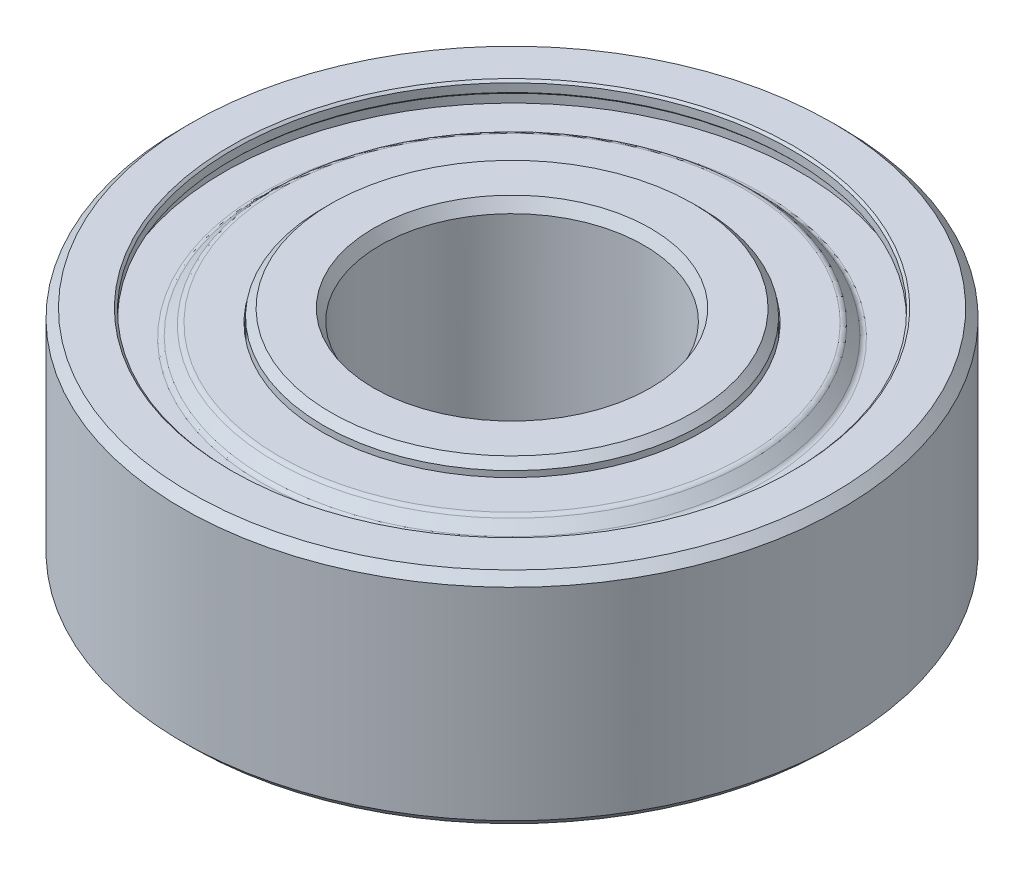
ISO-10303-21;
HEADER;
FILE_DESCRIPTION(('STEP AP214'),'2;1');
FILE_NAME('part.step','',(''),(''),'','','');
FILE_SCHEMA(('AUTOMOTIVE_DESIGN { 1 0 10303 214 1 1 1 1 }'));
ENDSEC;
DATA;
#1=APPLICATION_CONTEXT('core data for automotive mechanical design processes');
#2=APPLICATION_PROTOCOL_DEFINITION('international standard','automotive_design',2000,#1);
#3=PRODUCT_CONTEXT('',#1,'mechanical');
#4=PRODUCT('Part','Part','',(#3));
#5=PRODUCT_RELATED_PRODUCT_CATEGORY('part','',(#4));
#6=PRODUCT_DEFINITION_FORMATION('','',#4);
#7=PRODUCT_DEFINITION_CONTEXT('part definition',#1,'design');
#8=PRODUCT_DEFINITION('design','',#6,#7);
#9=PRODUCT_DEFINITION_SHAPE('','',#8);
#10=(LENGTH_UNIT() NAMED_UNIT(*) SI_UNIT(.MILLI.,.METRE.));
#11=(NAMED_UNIT(*) PLANE_ANGLE_UNIT() SI_UNIT($,.RADIAN.));
#12=(NAMED_UNIT(*) SI_UNIT($,.STERADIAN.) SOLID_ANGLE_UNIT());
#13=UNCERTAINTY_MEASURE_WITH_UNIT(LENGTH_MEASURE(1.E-05),#10,'distance_accuracy_value','');
#14=(GEOMETRIC_REPRESENTATION_CONTEXT(3) GLOBAL_UNCERTAINTY_ASSIGNED_CONTEXT((#13)) GLOBAL_UNIT_ASSIGNED_CONTEXT((#10,
#11,#12)) REPRESENTATION_CONTEXT('',''));
#15=CARTESIAN_POINT('',(0.,0.,0.));
#16=DIRECTION('',(0.,0.,1.));
#17=DIRECTION('',(1.,0.,0.));
#18=AXIS2_PLACEMENT_3D('',#15,#16,#17);
#19=CARTESIAN_POINT('',(0.,0.,0.));
#20=DIRECTION('',(0.,1.,0.));
#21=DIRECTION('',(0.,0.,1.));
#22=AXIS2_PLACEMENT_3D('',#19,#20,#21);
#23=CYLINDRICAL_SURFACE('',#22,3.);
#24=CARTESIAN_POINT('',(0.,4.74019237890388,0.));
#25=DIRECTION('',(0.,1.,0.));
#26=DIRECTION('',(0.,0.,1.));
#27=AXIS2_PLACEMENT_3D('',#24,#25,#26);
#28=CIRCLE('',#27,2.9999999999859);
#29=CARTESIAN_POINT('',(0.,4.74019237890388,2.9999999999859));
#30=VERTEX_POINT('',#29);
#31=EDGE_CURVE('E420',#30,#30,#28,.T.);
#32=ORIENTED_EDGE('',*,*,#31,.T.);
#33=EDGE_LOOP('',(#32));
#34=FACE_BOUND('',#33,.T.);
#35=CARTESIAN_POINT('',(0.,0.259807621148411,0.));
#36=DIRECTION('',(0.,-1.,0.));
#37=DIRECTION('',(0.,0.,-1.));
#38=AXIS2_PLACEMENT_3D('',#35,#36,#37);
#39=CIRCLE('',#38,3.00000000004275);
#40=CARTESIAN_POINT('',(0.,0.259807621148411,-3.00000000004275));
#41=VERTEX_POINT('',#40);
#42=EDGE_CURVE('E417',#41,#41,#39,.T.);
#43=ORIENTED_EDGE('',*,*,#42,.T.);
#44=EDGE_LOOP('',(#43));
#45=FACE_BOUND('',#44,.T.);
#46=ADVANCED_FACE('F16',(#34,#45),#23,.F.);
#47=CARTESIAN_POINT('',(0.,5.0000000000523,0.));
#48=DIRECTION('',(0.,1.,0.));
#49=DIRECTION('',(0.,0.,1.));
#50=AXIS2_PLACEMENT_3D('',#47,#48,#49);
#51=CONICAL_SURFACE('',#50,3.15000000000509,0.523598775631897);
#52=ORIENTED_EDGE('',*,*,#31,.F.);
#53=EDGE_LOOP('',(#52));
#54=FACE_BOUND('',#53,.T.);
#55=CARTESIAN_POINT('',(0.,5.0000000000523,0.));
#56=DIRECTION('',(0.,1.,0.));
#57=DIRECTION('',(0.,0.,1.));
#58=AXIS2_PLACEMENT_3D('',#55,#56,#57);
#59=CIRCLE('',#58,3.15000000000509);
#60=CARTESIAN_POINT('',(0.,5.0000000000523,3.15000000000509));
#61=VERTEX_POINT('',#60);
#62=EDGE_CURVE('E415',#61,#61,#59,.F.);
#63=ORIENTED_EDGE('',*,*,#62,.F.);
#64=EDGE_LOOP('',(#63));
#65=FACE_BOUND('',#64,.T.);
#66=ADVANCED_FACE('F185',(#54,#65),#51,.F.);
#67=CARTESIAN_POINT('',(0.,5.6843418860808E-11,0.));
#68=DIRECTION('',(0.,-1.,0.));
#69=DIRECTION('',(0.,0.,-1.));
#70=AXIS2_PLACEMENT_3D('',#67,#68,#69);
#71=CONICAL_SURFACE('',#70,3.15000000000509,0.523598775562543);
#72=CARTESIAN_POINT('',(0.,5.6843418860808E-11,0.));
#73=DIRECTION('',(0.,-1.,0.));
#74=DIRECTION('',(0.,0.,-1.));
#75=AXIS2_PLACEMENT_3D('',#72,#73,#74);
#76=CIRCLE('',#75,3.15000000000509);
#77=CARTESIAN_POINT('',(0.,5.6843418860808E-11,-3.15000000000509));
#78=VERTEX_POINT('',#77);
#79=EDGE_CURVE('E413',#78,#78,#76,.T.);
#80=ORIENTED_EDGE('',*,*,#79,.T.);
#81=EDGE_LOOP('',(#80));
#82=FACE_BOUND('',#81,.T.);
#83=ORIENTED_EDGE('',*,*,#42,.F.);
#84=EDGE_LOOP('',(#83));
#85=FACE_BOUND('',#84,.T.);
#86=ADVANCED_FACE('F182',(#82,#85),#71,.F.);
#87=CARTESIAN_POINT('',(0.,5.,0.));
#88=DIRECTION('',(0.,1.,0.));
#89=DIRECTION('',(0.,0.,1.));
#90=AXIS2_PLACEMENT_3D('',#87,#88,#89);
#91=PLANE('',#90);
#92=ORIENTED_EDGE('',*,*,#62,.T.);
#93=EDGE_LOOP('',(#92));
#94=FACE_BOUND('',#93,.T.);
#95=CARTESIAN_POINT('',(0.,4.99999999993861,0.));
#96=DIRECTION('',(0.,-1.,0.));
#97=DIRECTION('',(0.,0.,-1.));
#98=AXIS2_PLACEMENT_3D('',#95,#96,#97);
#99=CIRCLE('',#98,4.12000000000035);
#100=CARTESIAN_POINT('',(0.,4.99999999993861,-4.12000000000035));
#101=VERTEX_POINT('',#100);
#102=EDGE_CURVE('E410',#101,#101,#99,.T.);
#103=ORIENTED_EDGE('',*,*,#102,.F.);
#104=EDGE_LOOP('',(#103));
#105=FACE_BOUND('',#104,.T.);
#106=ADVANCED_FACE('F178',(#94,#105),#91,.T.);
#107=CARTESIAN_POINT('',(0.,0.,0.));
#108=DIRECTION('',(0.,1.,0.));
#109=DIRECTION('',(0.,0.,1.));
#110=AXIS2_PLACEMENT_3D('',#107,#108,#109);
#111=PLANE('',#110);
#112=ORIENTED_EDGE('',*,*,#79,.F.);
#113=EDGE_LOOP('',(#112));
#114=FACE_BOUND('',#113,.T.);
#115=CARTESIAN_POINT('',(0.,0.,0.));
#116=DIRECTION('',(0.,1.,0.));
#117=DIRECTION('',(0.,0.,1.));
#118=AXIS2_PLACEMENT_3D('',#115,#116,#117);
#119=CIRCLE('',#118,4.12000000000035);
#120=CARTESIAN_POINT('',(0.,0.,4.12000000000035));
#121=VERTEX_POINT('',#120);
#122=EDGE_CURVE('E406',#121,#121,#119,.T.);
#123=ORIENTED_EDGE('',*,*,#122,.F.);
#124=EDGE_LOOP('',(#123));
#125=FACE_BOUND('',#124,.T.);
#126=ADVANCED_FACE('F174',(#114,#125),#111,.F.);
#127=CARTESIAN_POINT('',(0.,4.82999999996991,0.));
#128=DIRECTION('',(0.,-1.,0.));
#129=DIRECTION('',(0.,0.,-1.));
#130=AXIS2_PLACEMENT_3D('',#127,#128,#129);
#131=CONICAL_SURFACE('',#130,4.28999999996904,0.785398163397448);
#132=CARTESIAN_POINT('',(0.,4.83,0.));
#133=DIRECTION('',(0.,1.,0.));
#134=DIRECTION('',(0.,0.,1.));
#135=AXIS2_PLACEMENT_3D('',#132,#133,#134);
#136=CIRCLE('',#135,4.29);
#137=CARTESIAN_POINT('',(0.,4.83,4.29));
#138=VERTEX_POINT('',#137);
#139=EDGE_CURVE('E409',#138,#138,#136,.F.);
#140=ORIENTED_EDGE('',*,*,#139,.F.);
#141=EDGE_LOOP('',(#140));
#142=FACE_BOUND('',#141,.T.);
#143=ORIENTED_EDGE('',*,*,#102,.T.);
#144=EDGE_LOOP('',(#143));
#145=FACE_BOUND('',#144,.T.);
#146=ADVANCED_FACE('F170',(#142,#145),#131,.T.);
#147=CARTESIAN_POINT('',(0.,0.169999999911852,0.));
#148=DIRECTION('',(0.,1.,0.));
#149=DIRECTION('',(0.,0.,1.));
#150=AXIS2_PLACEMENT_3D('',#147,#148,#149);
#151=CONICAL_SURFACE('',#150,4.28999999985535,0.785398163230262);
#152=ORIENTED_EDGE('',*,*,#122,.T.);
#153=EDGE_LOOP('',(#152));
#154=FACE_BOUND('',#153,.T.);
#155=CARTESIAN_POINT('',(0.,0.170000000000003,0.));
#156=DIRECTION('',(0.,-1.,0.));
#157=DIRECTION('',(0.,0.,-1.));
#158=AXIS2_PLACEMENT_3D('',#155,#156,#157);
#159=CIRCLE('',#158,4.29);
#160=CARTESIAN_POINT('',(0.,0.170000000000003,-4.29));
#161=VERTEX_POINT('',#160);
#162=EDGE_CURVE('E78',#161,#161,#159,.F.);
#163=ORIENTED_EDGE('',*,*,#162,.F.);
#164=EDGE_LOOP('',(#163));
#165=FACE_BOUND('',#164,.T.);
#166=ADVANCED_FACE('F166',(#154,#165),#151,.T.);
#167=CARTESIAN_POINT('',(0.,4.71,0.));
#168=DIRECTION('',(0.,1.,0.));
#169=DIRECTION('',(0.,0.,1.));
#170=AXIS2_PLACEMENT_3D('',#167,#168,#169);
#171=CYLINDRICAL_SURFACE('',#170,4.29);
#172=ORIENTED_EDGE('',*,*,#139,.T.);
#173=EDGE_LOOP('',(#172));
#174=FACE_BOUND('',#173,.T.);
#175=CARTESIAN_POINT('',(0.,4.456,0.));
#176=DIRECTION('',(0.,1.,0.));
#177=DIRECTION('',(0.,0.,1.));
#178=AXIS2_PLACEMENT_3D('',#175,#176,#177);
#179=CIRCLE('',#178,4.29);
#180=CARTESIAN_POINT('',(0.,4.456,4.29));
#181=VERTEX_POINT('',#180);
#182=EDGE_CURVE('E403',#181,#181,#179,.F.);
#183=ORIENTED_EDGE('',*,*,#182,.F.);
#184=EDGE_LOOP('',(#183));
#185=FACE_BOUND('',#184,.T.);
#186=ADVANCED_FACE('F162',(#174,#185),#171,.T.);
#187=CARTESIAN_POINT('',(0.,0.3,0.));
#188=DIRECTION('',(0.,-1.,0.));
#189=DIRECTION('',(0.,0.,-1.));
#190=AXIS2_PLACEMENT_3D('',#187,#188,#189);
#191=CYLINDRICAL_SURFACE('',#190,4.29);
#192=CARTESIAN_POINT('',(0.,0.544,0.));
#193=DIRECTION('',(0.,-1.,0.));
#194=DIRECTION('',(0.,0.,-1.));
#195=AXIS2_PLACEMENT_3D('',#192,#193,#194);
#196=CIRCLE('',#195,4.29);
#197=CARTESIAN_POINT('',(0.,0.544,-4.29));
#198=VERTEX_POINT('',#197);
#199=EDGE_CURVE('E400',#198,#198,#196,.F.);
#200=ORIENTED_EDGE('',*,*,#199,.F.);
#201=EDGE_LOOP('',(#200));
#202=FACE_BOUND('',#201,.T.);
#203=ORIENTED_EDGE('',*,*,#162,.T.);
#204=EDGE_LOOP('',(#203));
#205=FACE_BOUND('',#204,.T.);
#206=ADVANCED_FACE('F158',(#202,#205),#191,.T.);
#207=CARTESIAN_POINT('',(0.,4.456,0.));
#208=DIRECTION('',(0.,1.,0.));
#209=DIRECTION('',(0.,0.,1.));
#210=AXIS2_PLACEMENT_3D('',#207,#208,#209);
#211=PLANE('',#210);
#212=CARTESIAN_POINT('',(0.,4.456,0.));
#213=DIRECTION('',(0.,1.,0.));
#214=DIRECTION('',(0.,0.,1.));
#215=AXIS2_PLACEMENT_3D('',#212,#213,#214);
#216=CIRCLE('',#215,4.315);
#217=CARTESIAN_POINT('',(0.,4.456,4.315));
#218=VERTEX_POINT('',#217);
#219=EDGE_CURVE('E397',#218,#218,#216,.T.);
#220=ORIENTED_EDGE('',*,*,#219,.T.);
#221=EDGE_LOOP('',(#220));
#222=FACE_BOUND('',#221,.T.);
#223=ORIENTED_EDGE('',*,*,#182,.T.);
#224=EDGE_LOOP('',(#223));
#225=FACE_BOUND('',#224,.T.);
#226=ADVANCED_FACE('F154',(#222,#225),#211,.T.);
#227=CARTESIAN_POINT('',(0.,0.544,0.));
#228=DIRECTION('',(0.,-1.,0.));
#229=DIRECTION('',(0.,0.,-1.));
#230=AXIS2_PLACEMENT_3D('',#227,#228,#229);
#231=PLANE('',#230);
#232=CARTESIAN_POINT('',(0.,0.544,0.));
#233=DIRECTION('',(0.,-1.,0.));
#234=DIRECTION('',(0.,0.,-1.));
#235=AXIS2_PLACEMENT_3D('',#232,#233,#234);
#236=CIRCLE('',#235,4.315);
#237=CARTESIAN_POINT('',(0.,0.544,-4.315));
#238=VERTEX_POINT('',#237);
#239=EDGE_CURVE('E394',#238,#238,#236,.T.);
#240=ORIENTED_EDGE('',*,*,#239,.T.);
#241=EDGE_LOOP('',(#240));
#242=FACE_BOUND('',#241,.T.);
#243=ORIENTED_EDGE('',*,*,#199,.T.);
#244=EDGE_LOOP('',(#243));
#245=FACE_BOUND('',#244,.T.);
#246=ADVANCED_FACE('F150',(#242,#245),#231,.T.);
#247=CARTESIAN_POINT('',(0.,4.456,0.));
#248=DIRECTION('',(0.,1.,0.));
#249=DIRECTION('',(0.,0.,1.));
#250=AXIS2_PLACEMENT_3D('',#247,#248,#249);
#251=CYLINDRICAL_SURFACE('',#250,4.315);
#252=CARTESIAN_POINT('',(0.,4.71,0.));
#253=DIRECTION('',(0.,1.,0.));
#254=DIRECTION('',(0.,0.,1.));
#255=AXIS2_PLACEMENT_3D('',#252,#253,#254);
#256=CIRCLE('',#255,4.315);
#257=CARTESIAN_POINT('',(0.,4.71,4.315));
#258=VERTEX_POINT('',#257);
#259=EDGE_CURVE('E391',#258,#258,#256,.F.);
#260=ORIENTED_EDGE('',*,*,#259,.F.);
#261=EDGE_LOOP('',(#260));
#262=FACE_BOUND('',#261,.T.);
#263=ORIENTED_EDGE('',*,*,#219,.F.);
#264=EDGE_LOOP('',(#263));
#265=FACE_BOUND('',#264,.T.);
#266=ADVANCED_FACE('F146',(#262,#265),#251,.F.);
#267=CARTESIAN_POINT('',(0.,0.544,0.));
#268=DIRECTION('',(0.,-1.,0.));
#269=DIRECTION('',(0.,0.,-1.));
#270=AXIS2_PLACEMENT_3D('',#267,#268,#269);
#271=CYLINDRICAL_SURFACE('',#270,4.315);
#272=ORIENTED_EDGE('',*,*,#239,.F.);
#273=EDGE_LOOP('',(#272));
#274=FACE_BOUND('',#273,.T.);
#275=CARTESIAN_POINT('',(0.,0.3,0.));
#276=DIRECTION('',(0.,-1.,0.));
#277=DIRECTION('',(0.,0.,-1.));
#278=AXIS2_PLACEMENT_3D('',#275,#276,#277);
#279=CIRCLE('',#278,4.315);
#280=CARTESIAN_POINT('',(0.,0.3,-4.315));
#281=VERTEX_POINT('',#280);
#282=EDGE_CURVE('E64',#281,#281,#279,.F.);
#283=ORIENTED_EDGE('',*,*,#282,.F.);
#284=EDGE_LOOP('',(#283));
#285=FACE_BOUND('',#284,.T.);
#286=ADVANCED_FACE('F142',(#274,#285),#271,.F.);
#287=CARTESIAN_POINT('',(0.,4.71,0.));
#288=DIRECTION('',(0.,1.,0.));
#289=DIRECTION('',(0.,0.,1.));
#290=AXIS2_PLACEMENT_3D('',#287,#288,#289);
#291=PLANE('',#290);
#292=CARTESIAN_POINT('',(0.,4.71,0.));
#293=DIRECTION('',(0.,-1.,0.));
#294=DIRECTION('',(0.,0.,-1.));
#295=AXIS2_PLACEMENT_3D('',#292,#293,#294);
#296=CIRCLE('',#295,5.27978129677862);
#297=CARTESIAN_POINT('',(0.,4.71,-5.27978129677862));
#298=VERTEX_POINT('',#297);
#299=CARTESIAN_POINT('',(0.,4.71,5.27978129677862));
#300=VERTEX_POINT('',#299);
#301=EDGE_CURVE('E62',#298,#300,#296,.T.);
#302=ORIENTED_EDGE('',*,*,#301,.F.);
#303=CARTESIAN_POINT('',(0.,4.71,0.));
#304=DIRECTION('',(0.,-1.,0.));
#305=DIRECTION('',(0.,0.,1.));
#306=AXIS2_PLACEMENT_3D('',#303,#304,#305);
#307=CIRCLE('',#306,5.27978129677862);
#308=EDGE_CURVE('E56',#300,#298,#307,.T.);
#309=ORIENTED_EDGE('',*,*,#308,.F.);
#310=EDGE_LOOP('',(#302,#309));
#311=FACE_BOUND('',#310,.T.);
#312=ORIENTED_EDGE('',*,*,#259,.T.);
#313=EDGE_LOOP('',(#312));
#314=FACE_BOUND('',#313,.T.);
#315=ADVANCED_FACE('F60',(#311,#314),#291,.T.);
#316=CARTESIAN_POINT('',(0.,0.3,0.));
#317=DIRECTION('',(0.,-1.,0.));
#318=DIRECTION('',(0.,0.,-1.));
#319=AXIS2_PLACEMENT_3D('',#316,#317,#318);
#320=PLANE('',#319);
#321=ORIENTED_EDGE('',*,*,#282,.T.);
#322=EDGE_LOOP('',(#321));
#323=FACE_BOUND('',#322,.T.);
#324=CARTESIAN_POINT('',(0.,0.3,0.));
#325=DIRECTION('',(0.,1.,0.));
#326=DIRECTION('',(0.,0.,1.));
#327=AXIS2_PLACEMENT_3D('',#324,#325,#326);
#328=CIRCLE('',#327,5.27978129677861);
#329=CARTESIAN_POINT('',(0.,0.3,5.27978129677861));
#330=VERTEX_POINT('',#329);
#331=CARTESIAN_POINT('',(0.,0.3,-5.27978129677861));
#332=VERTEX_POINT('',#331);
#333=EDGE_CURVE('E105',#330,#332,#328,.T.);
#334=ORIENTED_EDGE('',*,*,#333,.F.);
#335=CARTESIAN_POINT('',(0.,0.3,0.));
#336=DIRECTION('',(0.,1.,0.));
#337=DIRECTION('',(0.,0.,-1.));
#338=AXIS2_PLACEMENT_3D('',#335,#336,#337);
#339=CIRCLE('',#338,5.27978129677861);
#340=EDGE_CURVE('E70',#332,#330,#339,.T.);
#341=ORIENTED_EDGE('',*,*,#340,.F.);
#342=EDGE_LOOP('',(#334,#341));
#343=FACE_BOUND('',#342,.T.);
#344=ADVANCED_FACE('F91',(#323,#343),#320,.T.);
#345=CARTESIAN_POINT('',(0.,4.56,0.));
#346=DIRECTION('',(0.,1.,0.));
#347=DIRECTION('',(0.,0.,1.));
#348=AXIS2_PLACEMENT_3D('',#345,#346,#347);
#349=TOROIDAL_SURFACE('',#348,5.27978129677862,0.15);
#350=ORIENTED_EDGE('',*,*,#308,.T.);
#351=ORIENTED_EDGE('',*,*,#301,.T.);
#352=EDGE_LOOP('',(#350,#351));
#353=FACE_BOUND('',#352,.T.);
#354=CARTESIAN_POINT('',(0.,4.66606601713693,0.));
#355=DIRECTION('',(0.,-1.,0.));
#356=DIRECTION('',(0.,0.,-1.));
#357=AXIS2_PLACEMENT_3D('',#354,#355,#356);
#358=CIRCLE('',#357,5.38584731390301);
#359=CARTESIAN_POINT('',(0.,4.66606601713693,-5.38584731390301));
#360=VERTEX_POINT('',#359);
#361=EDGE_CURVE('E100',#360,#360,#358,.T.);
#362=ORIENTED_EDGE('',*,*,#361,.F.);
#363=EDGE_LOOP('',(#362));
#364=FACE_BOUND('',#363,.T.);
#365=ADVANCED_FACE('F68',(#353,#364),#349,.T.);
#366=CARTESIAN_POINT('',(0.,0.45,0.));
#367=DIRECTION('',(0.,-1.,0.));
#368=DIRECTION('',(0.,0.,-1.));
#369=AXIS2_PLACEMENT_3D('',#366,#367,#368);
#370=TOROIDAL_SURFACE('',#369,5.27978129677861,0.15);
#371=ORIENTED_EDGE('',*,*,#340,.T.);
#372=ORIENTED_EDGE('',*,*,#333,.T.);
#373=EDGE_LOOP('',(#371,#372));
#374=FACE_BOUND('',#373,.T.);
#375=CARTESIAN_POINT('',(0.,0.343933982776434,0.));
#376=DIRECTION('',(0.,1.,0.));
#377=DIRECTION('',(0.,0.,1.));
#378=AXIS2_PLACEMENT_3D('',#375,#376,#377);
#379=CIRCLE('',#378,5.38584731390301);
#380=CARTESIAN_POINT('',(0.,0.343933982776434,5.38584731390301));
#381=VERTEX_POINT('',#380);
#382=EDGE_CURVE('E352',#381,#381,#379,.T.);
#383=ORIENTED_EDGE('',*,*,#382,.F.);
#384=EDGE_LOOP('',(#383));
#385=FACE_BOUND('',#384,.T.);
#386=ADVANCED_FACE('F90',(#374,#385),#370,.T.);
#387=CARTESIAN_POINT('',(0.,4.45393398274518,0.));
#388=DIRECTION('',(0.,-1.,0.));
#389=DIRECTION('',(0.,0.,-1.));
#390=AXIS2_PLACEMENT_3D('',#387,#388,#389);
#391=CONICAL_SURFACE('',#390,5.59797934829476,0.785398163397448);
#392=CARTESIAN_POINT('',(0.,4.45393398282202,0.));
#393=DIRECTION('',(0.,1.,0.));
#394=DIRECTION('',(0.,0.,1.));
#395=AXIS2_PLACEMENT_3D('',#392,#393,#394);
#396=CIRCLE('',#395,5.59797934831256);
#397=CARTESIAN_POINT('',(0.,4.45393398282202,5.59797934831256));
#398=VERTEX_POINT('',#397);
#399=EDGE_CURVE('E356',#398,#398,#396,.T.);
#400=ORIENTED_EDGE('',*,*,#399,.T.);
#401=EDGE_LOOP('',(#400));
#402=FACE_BOUND('',#401,.T.);
#403=ORIENTED_EDGE('',*,*,#361,.T.);
#404=EDGE_LOOP('',(#403));
#405=FACE_BOUND('',#404,.T.);
#406=ADVANCED_FACE('F531',(#402,#405),#391,.T.);
#407=CARTESIAN_POINT('',(0.,0.546066017193425,0.));
#408=DIRECTION('',(0.,1.,0.));
#409=DIRECTION('',(0.,0.,1.));
#410=AXIS2_PLACEMENT_3D('',#407,#408,#409);
#411=CONICAL_SURFACE('',#410,5.58797934837685,0.785398163538058);
#412=CARTESIAN_POINT('',(0.,0.546066017177981,0.));
#413=DIRECTION('',(0.,-1.,0.));
#414=DIRECTION('',(0.,0.,-1.));
#415=AXIS2_PLACEMENT_3D('',#412,#413,#414);
#416=CIRCLE('',#415,5.58797934831256);
#417=CARTESIAN_POINT('',(0.,0.546066017177981,-5.58797934831256));
#418=VERTEX_POINT('',#417);
#419=EDGE_CURVE('E361',#418,#418,#416,.T.);
#420=ORIENTED_EDGE('',*,*,#419,.T.);
#421=EDGE_LOOP('',(#420));
#422=FACE_BOUND('',#421,.T.);
#423=ORIENTED_EDGE('',*,*,#382,.T.);
#424=EDGE_LOOP('',(#423));
#425=FACE_BOUND('',#424,.T.);
#426=ADVANCED_FACE('F537',(#422,#425),#411,.T.);
#427=CARTESIAN_POINT('',(0.,4.56,0.));
#428=DIRECTION('',(0.,1.,0.));
#429=DIRECTION('',(0.,0.,1.));
#430=AXIS2_PLACEMENT_3D('',#427,#428,#429);
#431=TOROIDAL_SURFACE('',#430,5.70404536549055,0.15);
#432=ORIENTED_EDGE('',*,*,#399,.F.);
#433=EDGE_LOOP('',(#432));
#434=FACE_BOUND('',#433,.T.);
#435=CARTESIAN_POINT('',(0.,4.41,0.));
#436=DIRECTION('',(0.,1.,0.));
#437=DIRECTION('',(0.,0.,-1.));
#438=AXIS2_PLACEMENT_3D('',#435,#436,#437);
#439=CIRCLE('',#438,5.70404536549055);
#440=CARTESIAN_POINT('',(0.,4.41,5.70404536549055));
#441=VERTEX_POINT('',#440);
#442=CARTESIAN_POINT('',(0.,4.41,-5.70404536549055));
#443=VERTEX_POINT('',#442);
#444=EDGE_CURVE('E288',#441,#443,#439,.F.);
#445=ORIENTED_EDGE('',*,*,#444,.F.);
#446=CARTESIAN_POINT('',(0.,4.41,0.));
#447=DIRECTION('',(0.,1.,0.));
#448=DIRECTION('',(0.,0.,1.));
#449=AXIS2_PLACEMENT_3D('',#446,#447,#448);
#450=CIRCLE('',#449,5.70404536549055);
#451=EDGE_CURVE('E298',#443,#441,#450,.F.);
#452=ORIENTED_EDGE('',*,*,#451,.F.);
#453=EDGE_LOOP('',(#445,#452));
#454=FACE_BOUND('',#453,.T.);
#455=ADVANCED_FACE('F313',(#434,#454),#431,.F.);
#456=CARTESIAN_POINT('',(0.,0.44,0.));
#457=DIRECTION('',(0.,-1.,0.));
#458=DIRECTION('',(0.,0.,-1.));
#459=AXIS2_PLACEMENT_3D('',#456,#457,#458);
#460=TOROIDAL_SURFACE('',#459,5.69404536549054,0.15);
#461=ORIENTED_EDGE('',*,*,#419,.F.);
#462=EDGE_LOOP('',(#461));
#463=FACE_BOUND('',#462,.T.);
#464=CARTESIAN_POINT('',(0.,0.59,0.));
#465=DIRECTION('',(0.,-1.,0.));
#466=DIRECTION('',(0.,0.,1.));
#467=AXIS2_PLACEMENT_3D('',#464,#465,#466);
#468=CIRCLE('',#467,5.69404536549054);
#469=CARTESIAN_POINT('',(0.,0.59,-5.69404536549054));
#470=VERTEX_POINT('',#469);
#471=CARTESIAN_POINT('',(0.,0.59,5.69404536549054));
#472=VERTEX_POINT('',#471);
#473=EDGE_CURVE('E376',#470,#472,#468,.F.);
#474=ORIENTED_EDGE('',*,*,#473,.F.);
#475=CARTESIAN_POINT('',(0.,0.59,0.));
#476=DIRECTION('',(0.,-1.,0.));
#477=DIRECTION('',(0.,0.,-1.));
#478=AXIS2_PLACEMENT_3D('',#475,#476,#477);
#479=CIRCLE('',#478,5.69404536549054);
#480=EDGE_CURVE('E35',#472,#470,#479,.F.);
#481=ORIENTED_EDGE('',*,*,#480,.F.);
#482=EDGE_LOOP('',(#474,#481));
#483=FACE_BOUND('',#482,.T.);
#484=ADVANCED_FACE('F309',(#463,#483),#460,.F.);
#485=CARTESIAN_POINT('',(0.,4.41,0.));
#486=DIRECTION('',(0.,1.,0.));
#487=DIRECTION('',(0.,0.,1.));
#488=AXIS2_PLACEMENT_3D('',#485,#486,#487);
#489=PLANE('',#488);
#490=CARTESIAN_POINT('',(0.,4.41,0.));
#491=DIRECTION('',(0.,1.,0.));
#492=DIRECTION('',(0.,0.,1.));
#493=AXIS2_PLACEMENT_3D('',#490,#491,#492);
#494=CIRCLE('',#493,6.55);
#495=CARTESIAN_POINT('',(0.,4.41,6.55));
#496=VERTEX_POINT('',#495);
#497=EDGE_CURVE('E378',#496,#496,#494,.T.);
#498=ORIENTED_EDGE('',*,*,#497,.T.);
#499=EDGE_LOOP('',(#498));
#500=FACE_BOUND('',#499,.T.);
#501=ORIENTED_EDGE('',*,*,#444,.T.);
#502=ORIENTED_EDGE('',*,*,#451,.T.);
#503=EDGE_LOOP('',(#501,#502));
#504=FACE_BOUND('',#503,.T.);
#505=ADVANCED_FACE('F265',(#500,#504),#489,.T.);
#506=CARTESIAN_POINT('',(0.,0.59,0.));
#507=DIRECTION('',(0.,-1.,0.));
#508=DIRECTION('',(0.,0.,-1.));
#509=AXIS2_PLACEMENT_3D('',#506,#507,#508);
#510=PLANE('',#509);
#511=CARTESIAN_POINT('',(0.,0.59,0.));
#512=DIRECTION('',(0.,-1.,0.));
#513=DIRECTION('',(0.,0.,-1.));
#514=AXIS2_PLACEMENT_3D('',#511,#512,#513);
#515=CIRCLE('',#514,6.55);
#516=CARTESIAN_POINT('',(0.,0.59,-6.55));
#517=VERTEX_POINT('',#516);
#518=EDGE_CURVE('E380',#517,#517,#515,.T.);
#519=ORIENTED_EDGE('',*,*,#518,.T.);
#520=EDGE_LOOP('',(#519));
#521=FACE_BOUND('',#520,.T.);
#522=ORIENTED_EDGE('',*,*,#473,.T.);
#523=ORIENTED_EDGE('',*,*,#480,.T.);
#524=EDGE_LOOP('',(#522,#523));
#525=FACE_BOUND('',#524,.T.);
#526=ADVANCED_FACE('F260',(#521,#525),#510,.T.);
#527=CARTESIAN_POINT('',(0.,4.41,0.));
#528=DIRECTION('',(0.,1.,0.));
#529=DIRECTION('',(0.,0.,1.));
#530=AXIS2_PLACEMENT_3D('',#527,#528,#529);
#531=CYLINDRICAL_SURFACE('',#530,6.55);
#532=ORIENTED_EDGE('',*,*,#497,.F.);
#533=EDGE_LOOP('',(#532));
#534=FACE_BOUND('',#533,.T.);
#535=CARTESIAN_POINT('',(0.,4.71,0.));
#536=DIRECTION('',(0.,1.,0.));
#537=DIRECTION('',(0.,0.,1.));
#538=AXIS2_PLACEMENT_3D('',#535,#536,#537);
#539=CIRCLE('',#538,6.55);
#540=CARTESIAN_POINT('',(0.,4.71,6.55));
#541=VERTEX_POINT('',#540);
#542=EDGE_CURVE('E385',#541,#541,#539,.T.);
#543=ORIENTED_EDGE('',*,*,#542,.T.);
#544=EDGE_LOOP('',(#543));
#545=FACE_BOUND('',#544,.T.);
#546=ADVANCED_FACE('F256',(#534,#545),#531,.F.);
#547=CARTESIAN_POINT('',(0.,0.59,0.));
#548=DIRECTION('',(0.,-1.,0.));
#549=DIRECTION('',(0.,0.,-1.));
#550=AXIS2_PLACEMENT_3D('',#547,#548,#549);
#551=CYLINDRICAL_SURFACE('',#550,6.55);
#552=CARTESIAN_POINT('',(0.,0.29,0.));
#553=DIRECTION('',(0.,-1.,0.));
#554=DIRECTION('',(0.,0.,-1.));
#555=AXIS2_PLACEMENT_3D('',#552,#553,#554);
#556=CIRCLE('',#555,6.55);
#557=CARTESIAN_POINT('',(0.,0.29,-6.55));
#558=VERTEX_POINT('',#557);
#559=EDGE_CURVE('E447',#558,#558,#556,.T.);
#560=ORIENTED_EDGE('',*,*,#559,.T.);
#561=EDGE_LOOP('',(#560));
#562=FACE_BOUND('',#561,.T.);
#563=ORIENTED_EDGE('',*,*,#518,.F.);
#564=EDGE_LOOP('',(#563));
#565=FACE_BOUND('',#564,.T.);
#566=ADVANCED_FACE('F252',(#562,#565),#551,.F.);
#567=CARTESIAN_POINT('',(0.,4.71,0.));
#568=DIRECTION('',(0.,1.,0.));
#569=DIRECTION('',(0.,0.,1.));
#570=AXIS2_PLACEMENT_3D('',#567,#568,#569);
#571=PLANE('',#570);
#572=ORIENTED_EDGE('',*,*,#542,.F.);
#573=EDGE_LOOP('',(#572));
#574=FACE_BOUND('',#573,.T.);
#575=CARTESIAN_POINT('',(0.,4.70999999998867,0.));
#576=DIRECTION('',(0.,-1.,0.));
#577=DIRECTION('',(0.,0.,-1.));
#578=AXIS2_PLACEMENT_3D('',#575,#576,#577);
#579=CIRCLE('',#578,6.40000000004193);
#580=CARTESIAN_POINT('',(0.,4.70999999998867,-6.40000000004193));
#581=VERTEX_POINT('',#580);
#582=EDGE_CURVE('E444',#581,#581,#579,.F.);
#583=ORIENTED_EDGE('',*,*,#582,.T.);
#584=EDGE_LOOP('',(#583));
#585=FACE_BOUND('',#584,.T.);
#586=ADVANCED_FACE('F248',(#574,#585),#571,.F.);
#587=CARTESIAN_POINT('',(0.,0.29,0.));
#588=DIRECTION('',(0.,-1.,0.));
#589=DIRECTION('',(0.,0.,-1.));
#590=AXIS2_PLACEMENT_3D('',#587,#588,#589);
#591=PLANE('',#590);
#592=ORIENTED_EDGE('',*,*,#559,.F.);
#593=EDGE_LOOP('',(#592));
#594=FACE_BOUND('',#593,.T.);
#595=CARTESIAN_POINT('',(0.,0.290000000006785,0.));
#596=DIRECTION('',(0.,1.,0.));
#597=DIRECTION('',(0.,0.,1.));
#598=AXIS2_PLACEMENT_3D('',#595,#596,#597);
#599=CIRCLE('',#598,6.39999999998508);
#600=CARTESIAN_POINT('',(0.,0.290000000006785,6.39999999998508));
#601=VERTEX_POINT('',#600);
#602=EDGE_CURVE('E440',#601,#601,#599,.F.);
#603=ORIENTED_EDGE('',*,*,#602,.T.);
#604=EDGE_LOOP('',(#603));
#605=FACE_BOUND('',#604,.T.);
#606=ADVANCED_FACE('F244',(#594,#605),#591,.F.);
#607=CARTESIAN_POINT('',(0.,4.70999999998867,0.));
#608=DIRECTION('',(0.,-1.,0.));
#609=DIRECTION('',(0.,0.,-1.));
#610=AXIS2_PLACEMENT_3D('',#607,#608,#609);
#611=CONICAL_SURFACE('',#610,6.40000000004193,0.785398163397448);
#612=CARTESIAN_POINT('',(0.,4.76,0.));
#613=DIRECTION('',(0.,1.,0.));
#614=DIRECTION('',(0.,0.,1.));
#615=AXIS2_PLACEMENT_3D('',#612,#613,#614);
#616=CIRCLE('',#615,6.35);
#617=CARTESIAN_POINT('',(0.,4.76,6.35));
#618=VERTEX_POINT('',#617);
#619=EDGE_CURVE('E443',#618,#618,#616,.T.);
#620=ORIENTED_EDGE('',*,*,#619,.T.);
#621=EDGE_LOOP('',(#620));
#622=FACE_BOUND('',#621,.T.);
#623=ORIENTED_EDGE('',*,*,#582,.F.);
#624=EDGE_LOOP('',(#623));
#625=FACE_BOUND('',#624,.T.);
#626=ADVANCED_FACE('F240',(#622,#625),#611,.F.);
#627=CARTESIAN_POINT('',(0.,0.290000000006785,0.));
#628=DIRECTION('',(0.,1.,0.));
#629=DIRECTION('',(0.,0.,1.));
#630=AXIS2_PLACEMENT_3D('',#627,#628,#629);
#631=CONICAL_SURFACE('',#630,6.39999999998508,0.785398163397448);
#632=ORIENTED_EDGE('',*,*,#602,.F.);
#633=EDGE_LOOP('',(#632));
#634=FACE_BOUND('',#633,.T.);
#635=CARTESIAN_POINT('',(0.,0.239999999999998,0.));
#636=DIRECTION('',(0.,-1.,0.));
#637=DIRECTION('',(0.,0.,-1.));
#638=AXIS2_PLACEMENT_3D('',#635,#636,#637);
#639=CIRCLE('',#638,6.35);
#640=CARTESIAN_POINT('',(0.,0.239999999999998,-6.35));
#641=VERTEX_POINT('',#640);
#642=EDGE_CURVE('E462',#641,#641,#639,.T.);
#643=ORIENTED_EDGE('',*,*,#642,.T.);
#644=EDGE_LOOP('',(#643));
#645=FACE_BOUND('',#644,.T.);
#646=ADVANCED_FACE('F236',(#634,#645),#631,.F.);
#647=CARTESIAN_POINT('',(0.,4.71,0.));
#648=DIRECTION('',(0.,1.,0.));
#649=DIRECTION('',(0.,0.,1.));
#650=AXIS2_PLACEMENT_3D('',#647,#648,#649);
#651=CYLINDRICAL_SURFACE('',#650,6.35);
#652=ORIENTED_EDGE('',*,*,#619,.F.);
#653=EDGE_LOOP('',(#652));
#654=FACE_BOUND('',#653,.T.);
#655=CARTESIAN_POINT('',(0.,4.94999999995116,0.));
#656=DIRECTION('',(0.,1.,0.));
#657=DIRECTION('',(0.,0.,1.));
#658=AXIS2_PLACEMENT_3D('',#655,#656,#657);
#659=CIRCLE('',#658,6.34999999999764);
#660=CARTESIAN_POINT('',(0.,4.94999999995116,6.34999999999764));
#661=VERTEX_POINT('',#660);
#662=EDGE_CURVE('E464',#661,#661,#659,.T.);
#663=ORIENTED_EDGE('',*,*,#662,.T.);
#664=EDGE_LOOP('',(#663));
#665=FACE_BOUND('',#664,.T.);
#666=ADVANCED_FACE('F232',(#654,#665),#651,.F.);
#667=CARTESIAN_POINT('',(0.,0.3,0.));
#668=DIRECTION('',(0.,-1.,0.));
#669=DIRECTION('',(0.,0.,-1.));
#670=AXIS2_PLACEMENT_3D('',#667,#668,#669);
#671=CYLINDRICAL_SURFACE('',#670,6.35);
#672=CARTESIAN_POINT('',(0.,0.0500000000442924,0.));
#673=DIRECTION('',(0.,-1.,0.));
#674=DIRECTION('',(0.,0.,-1.));
#675=AXIS2_PLACEMENT_3D('',#672,#673,#674);
#676=CIRCLE('',#675,6.34999999999764);
#677=CARTESIAN_POINT('',(0.,0.0500000000442924,-6.34999999999764));
#678=VERTEX_POINT('',#677);
#679=EDGE_CURVE('E439',#678,#678,#676,.T.);
#680=ORIENTED_EDGE('',*,*,#679,.T.);
#681=EDGE_LOOP('',(#680));
#682=FACE_BOUND('',#681,.T.);
#683=ORIENTED_EDGE('',*,*,#642,.F.);
#684=EDGE_LOOP('',(#683));
#685=FACE_BOUND('',#684,.T.);
#686=ADVANCED_FACE('F228',(#682,#685),#671,.F.);
#687=CARTESIAN_POINT('',(0.,4.99999999999545,0.));
#688=DIRECTION('',(0.,1.,0.));
#689=DIRECTION('',(0.,0.,1.));
#690=AXIS2_PLACEMENT_3D('',#687,#688,#689);
#691=CONICAL_SURFACE('',#690,6.40000000004193,0.785398163397448);
#692=ORIENTED_EDGE('',*,*,#662,.F.);
#693=EDGE_LOOP('',(#692));
#694=FACE_BOUND('',#693,.T.);
#695=CARTESIAN_POINT('',(0.,4.99999999999545,0.));
#696=DIRECTION('',(0.,1.,0.));
#697=DIRECTION('',(0.,0.,1.));
#698=AXIS2_PLACEMENT_3D('',#695,#696,#697);
#699=CIRCLE('',#698,6.40000000004193);
#700=CARTESIAN_POINT('',(0.,4.99999999999545,6.40000000004193));
#701=VERTEX_POINT('',#700);
#702=EDGE_CURVE('E436',#701,#701,#699,.F.);
#703=ORIENTED_EDGE('',*,*,#702,.F.);
#704=EDGE_LOOP('',(#703));
#705=FACE_BOUND('',#704,.T.);
#706=ADVANCED_FACE('F224',(#694,#705),#691,.F.);
#707=CARTESIAN_POINT('',(0.,5.6843418860808E-11,0.));
#708=DIRECTION('',(0.,-1.,0.));
#709=DIRECTION('',(0.,0.,-1.));
#710=AXIS2_PLACEMENT_3D('',#707,#708,#709);
#711=CONICAL_SURFACE('',#710,6.39999999998508,0.785398163397448);
#712=CARTESIAN_POINT('',(0.,0.,0.));
#713=DIRECTION('',(0.,-1.,0.));
#714=DIRECTION('',(0.,0.,-1.));
#715=AXIS2_PLACEMENT_3D('',#712,#713,#714);
#716=CIRCLE('',#715,6.40000000004193);
#717=CARTESIAN_POINT('',(0.,0.,-6.40000000004193));
#718=VERTEX_POINT('',#717);
#719=EDGE_CURVE('E433',#718,#718,#716,.T.);
#720=ORIENTED_EDGE('',*,*,#719,.T.);
#721=EDGE_LOOP('',(#720));
#722=FACE_BOUND('',#721,.T.);
#723=ORIENTED_EDGE('',*,*,#679,.F.);
#724=EDGE_LOOP('',(#723));
#725=FACE_BOUND('',#724,.T.);
#726=ADVANCED_FACE('F220',(#722,#725),#711,.F.);
#727=CARTESIAN_POINT('',(0.,5.,0.));
#728=DIRECTION('',(0.,1.,0.));
#729=DIRECTION('',(0.,0.,1.));
#730=AXIS2_PLACEMENT_3D('',#727,#728,#729);
#731=PLANE('',#730);
#732=ORIENTED_EDGE('',*,*,#702,.T.);
#733=EDGE_LOOP('',(#732));
#734=FACE_BOUND('',#733,.T.);
#735=CARTESIAN_POINT('',(0.,5.,0.));
#736=DIRECTION('',(0.,-1.,0.));
#737=DIRECTION('',(0.,0.,-1.));
#738=AXIS2_PLACEMENT_3D('',#735,#736,#737);
#739=CIRCLE('',#738,7.3);
#740=CARTESIAN_POINT('',(0.,5.,-7.3));
#741=VERTEX_POINT('',#740);
#742=EDGE_CURVE('E430',#741,#741,#739,.T.);
#743=ORIENTED_EDGE('',*,*,#742,.F.);
#744=EDGE_LOOP('',(#743));
#745=FACE_BOUND('',#744,.T.);
#746=ADVANCED_FACE('F216',(#734,#745),#731,.T.);
#747=CARTESIAN_POINT('',(0.,0.,0.));
#748=DIRECTION('',(0.,1.,0.));
#749=DIRECTION('',(0.,0.,1.));
#750=AXIS2_PLACEMENT_3D('',#747,#748,#749);
#751=PLANE('',#750);
#752=CARTESIAN_POINT('',(0.,0.,0.));
#753=DIRECTION('',(0.,1.,0.));
#754=DIRECTION('',(-1.,0.,0.));
#755=AXIS2_PLACEMENT_3D('',#752,#753,#754);
#756=CIRCLE('',#755,7.3);
#757=CARTESIAN_POINT('',(-7.3,0.,0.));
#758=VERTEX_POINT('',#757);
#759=EDGE_CURVE('E427',#758,#758,#756,.T.);
#760=ORIENTED_EDGE('',*,*,#759,.F.);
#761=EDGE_LOOP('',(#760));
#762=FACE_BOUND('',#761,.T.);
#763=ORIENTED_EDGE('',*,*,#719,.F.);
#764=EDGE_LOOP('',(#763));
#765=FACE_BOUND('',#764,.T.);
#766=ADVANCED_FACE('F212',(#762,#765),#751,.F.);
#767=CARTESIAN_POINT('',(0.,4.8,0.));
#768=DIRECTION('',(0.,-1.,0.));
#769=DIRECTION('',(0.,0.,-1.));
#770=AXIS2_PLACEMENT_3D('',#767,#768,#769);
#771=CONICAL_SURFACE('',#770,7.5,0.785398163397448);
#772=CARTESIAN_POINT('',(0.,4.8,0.));
#773=DIRECTION('',(0.,-1.,0.));
#774=DIRECTION('',(0.,0.,-1.));
#775=AXIS2_PLACEMENT_3D('',#772,#773,#774);
#776=CIRCLE('',#775,7.5);
#777=CARTESIAN_POINT('',(0.,4.8,-7.5));
#778=VERTEX_POINT('',#777);
#779=EDGE_CURVE('E27',#778,#778,#776,.T.);
#780=ORIENTED_EDGE('',*,*,#779,.F.);
#781=EDGE_LOOP('',(#780));
#782=FACE_BOUND('',#781,.T.);
#783=ORIENTED_EDGE('',*,*,#742,.T.);
#784=EDGE_LOOP('',(#783));
#785=FACE_BOUND('',#784,.T.);
#786=ADVANCED_FACE('F205',(#782,#785),#771,.T.);
#787=CARTESIAN_POINT('',(0.,0.199999999999999,0.));
#788=DIRECTION('',(0.,1.,0.));
#789=DIRECTION('',(-1.,0.,0.));
#790=AXIS2_PLACEMENT_3D('',#787,#788,#789);
#791=CONICAL_SURFACE('',#790,7.5,0.785398163397453);
#792=CARTESIAN_POINT('',(0.,0.199999999999998,0.));
#793=DIRECTION('',(0.,-1.,0.));
#794=DIRECTION('',(0.,0.,-1.));
#795=AXIS2_PLACEMENT_3D('',#792,#793,#794);
#796=CIRCLE('',#795,7.5);
#797=CARTESIAN_POINT('',(0.,0.199999999999998,-7.5));
#798=VERTEX_POINT('',#797);
#799=EDGE_CURVE('E11',#798,#798,#796,.F.);
#800=ORIENTED_EDGE('',*,*,#799,.F.);
#801=EDGE_LOOP('',(#800));
#802=FACE_BOUND('',#801,.T.);
#803=ORIENTED_EDGE('',*,*,#759,.T.);
#804=EDGE_LOOP('',(#803));
#805=FACE_BOUND('',#804,.T.);
#806=ADVANCED_FACE('F199',(#802,#805),#791,.T.);
#807=CARTESIAN_POINT('',(0.,4.05,0.));
#808=DIRECTION('',(0.,-1.,0.));
#809=DIRECTION('',(0.,0.,-1.));
#810=AXIS2_PLACEMENT_3D('',#807,#808,#809);
#811=CYLINDRICAL_SURFACE('',#810,7.5);
#812=ORIENTED_EDGE('',*,*,#799,.T.);
#813=EDGE_LOOP('',(#812));
#814=FACE_BOUND('',#813,.T.);
#815=ORIENTED_EDGE('',*,*,#779,.T.);
#816=EDGE_LOOP('',(#815));
#817=FACE_BOUND('',#816,.T.);
#818=ADVANCED_FACE('F197',(#814,#817),#811,.T.);
#819=CLOSED_SHELL('',(#46,#66,#86,#106,#126,#146,#166,#186,#206,#226,#246,#266,#286,#315,#344,
#365,#386,#406,#426,#455,#484,#505,#526,#546,#566,#586,#606,#626,#646,#666,#686,#706,#726,#746,
#766,#786,#806,#818));
#820=MANIFOLD_SOLID_BREP('B1',#819);
#821=ADVANCED_BREP_SHAPE_REPRESENTATION('',(#18,#820),#14);
#822=SHAPE_DEFINITION_REPRESENTATION(#9,#821);
ENDSEC;
END-ISO-10303-21;
